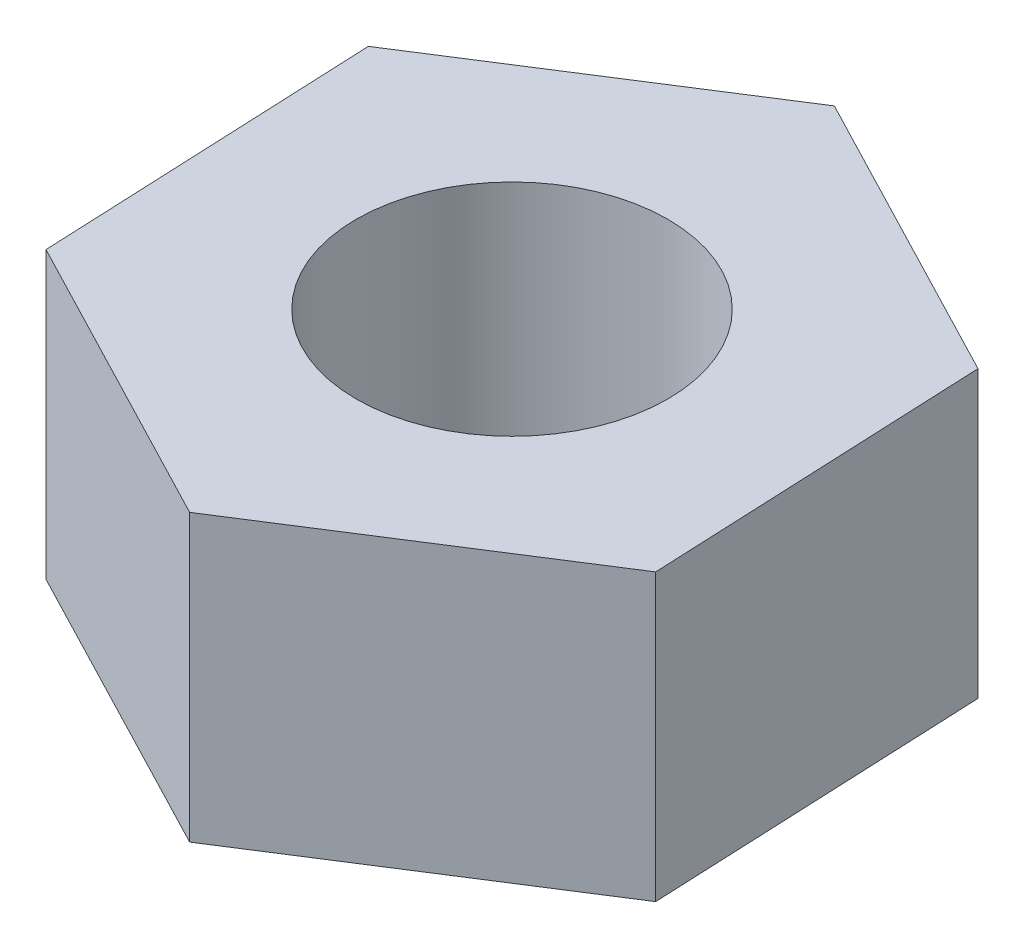
ISO-10303-21;
HEADER;
FILE_DESCRIPTION(('STEP AP214'),'2;1');
FILE_NAME('part.step','',(''),(''),'','','');
FILE_SCHEMA(('AUTOMOTIVE_DESIGN { 1 0 10303 214 1 1 1 1 }'));
ENDSEC;
DATA;
#1=APPLICATION_CONTEXT('core data for automotive mechanical design processes');
#2=APPLICATION_PROTOCOL_DEFINITION('international standard','automotive_design',2000,#1);
#3=PRODUCT_CONTEXT('',#1,'mechanical');
#4=PRODUCT('Part','Part','',(#3));
#5=PRODUCT_RELATED_PRODUCT_CATEGORY('part','',(#4));
#6=PRODUCT_DEFINITION_FORMATION('','',#4);
#7=PRODUCT_DEFINITION_CONTEXT('part definition',#1,'design');
#8=PRODUCT_DEFINITION('design','',#6,#7);
#9=PRODUCT_DEFINITION_SHAPE('','',#8);
#10=(LENGTH_UNIT() NAMED_UNIT(*) SI_UNIT(.MILLI.,.METRE.));
#11=(NAMED_UNIT(*) PLANE_ANGLE_UNIT() SI_UNIT($,.RADIAN.));
#12=(NAMED_UNIT(*) SI_UNIT($,.STERADIAN.) SOLID_ANGLE_UNIT());
#13=UNCERTAINTY_MEASURE_WITH_UNIT(LENGTH_MEASURE(1.E-05),#10,'distance_accuracy_value','');
#14=(GEOMETRIC_REPRESENTATION_CONTEXT(3) GLOBAL_UNCERTAINTY_ASSIGNED_CONTEXT((#13)) GLOBAL_UNIT_ASSIGNED_CONTEXT((#10,
#11,#12)) REPRESENTATION_CONTEXT('',''));
#15=CARTESIAN_POINT('',(0.,0.,0.));
#16=DIRECTION('',(0.,0.,1.));
#17=DIRECTION('',(1.,0.,0.));
#18=AXIS2_PLACEMENT_3D('',#15,#16,#17);
#19=CARTESIAN_POINT('',(-0.285815994218681,5.5,-6.49371305321147));
#20=DIRECTION('',(-0.461435786892992,0.,0.887173610165702));
#21=DIRECTION('',(-0.887173610165702,0.,-0.461435786892992));
#22=AXIS2_PLACEMENT_3D('',#19,#20,#21);
#23=PLANE('',#22);
#24=DIRECTION('',(0.887173610165702,0.,0.461435786892992));
#25=VECTOR('',#24,1.);
#26=CARTESIAN_POINT('',(-0.285815994218681,0.,-6.49371305321147));
#27=LINE('',#26,#25);
#28=CARTESIAN_POINT('',(-0.285815994218681,0.,-6.49371305321147));
#29=VERTEX_POINT('',#28);
#30=CARTESIAN_POINT('',(5.4808124718584,0.,-3.49438043840702));
#31=VERTEX_POINT('',#30);
#32=EDGE_CURVE('E120',#29,#31,#27,.T.);
#33=ORIENTED_EDGE('',*,*,#32,.F.);
#34=DIRECTION('',(0.,-1.,0.));
#35=VECTOR('',#34,1.);
#36=CARTESIAN_POINT('',(-0.285815994218681,5.5,-6.49371305321147));
#37=LINE('',#36,#35);
#38=CARTESIAN_POINT('',(-0.285815994218681,5.5,-6.49371305321147));
#39=VERTEX_POINT('',#38);
#40=EDGE_CURVE('E119',#39,#29,#37,.T.);
#41=ORIENTED_EDGE('',*,*,#40,.F.);
#42=DIRECTION('',(0.887173610165702,0.,0.461435786892992));
#43=VECTOR('',#42,1.);
#44=CARTESIAN_POINT('',(-0.285815994218681,5.5,-6.49371305321147));
#45=LINE('',#44,#43);
#46=CARTESIAN_POINT('',(5.4808124718584,5.5,-3.49438043840702));
#47=VERTEX_POINT('',#46);
#48=EDGE_CURVE('E133',#39,#47,#45,.T.);
#49=ORIENTED_EDGE('',*,*,#48,.T.);
#50=DIRECTION('',(0.,-1.,0.));
#51=VECTOR('',#50,1.);
#52=CARTESIAN_POINT('',(5.4808124718584,5.5,-3.49438043840702));
#53=LINE('',#52,#51);
#54=EDGE_CURVE('E11',#47,#31,#53,.T.);
#55=ORIENTED_EDGE('',*,*,#54,.T.);
#56=EDGE_LOOP('',(#33,#41,#49,#55));
#57=FACE_BOUND('',#56,.T.);
#58=ADVANCED_FACE('F37',(#57),#23,.F.);
#59=CARTESIAN_POINT('',(5.4808124718584,5.5,-3.49438043840702));
#60=DIRECTION('',(-0.999032777417146,0.,0.0439716914182564));
#61=DIRECTION('',(-0.0439716914182564,0.,-0.999032777417146));
#62=AXIS2_PLACEMENT_3D('',#59,#60,#61);
#63=PLANE('',#62);
#64=DIRECTION('',(0.0439716914182564,0.,0.999032777417146));
#65=VECTOR('',#64,1.);
#66=CARTESIAN_POINT('',(5.4808124718584,0.,-3.49438043840702));
#67=LINE('',#66,#65);
#68=CARTESIAN_POINT('',(5.76662846607707,0.,2.99933261480445));
#69=VERTEX_POINT('',#68);
#70=EDGE_CURVE('E122',#31,#69,#67,.T.);
#71=ORIENTED_EDGE('',*,*,#70,.F.);
#72=ORIENTED_EDGE('',*,*,#54,.F.);
#73=DIRECTION('',(0.0439716914182564,0.,0.999032777417146));
#74=VECTOR('',#73,1.);
#75=CARTESIAN_POINT('',(5.4808124718584,5.5,-3.49438043840702));
#76=LINE('',#75,#74);
#77=CARTESIAN_POINT('',(5.76662846607707,5.5,2.99933261480445));
#78=VERTEX_POINT('',#77);
#79=EDGE_CURVE('E85',#47,#78,#76,.T.);
#80=ORIENTED_EDGE('',*,*,#79,.T.);
#81=DIRECTION('',(0.,-1.,0.));
#82=VECTOR('',#81,1.);
#83=CARTESIAN_POINT('',(5.76662846607707,5.5,2.99933261480445));
#84=LINE('',#83,#82);
#85=EDGE_CURVE('E45',#78,#69,#84,.T.);
#86=ORIENTED_EDGE('',*,*,#85,.T.);
#87=EDGE_LOOP('',(#71,#72,#80,#86));
#88=FACE_BOUND('',#87,.T.);
#89=ADVANCED_FACE('F139',(#88),#63,.F.);
#90=CARTESIAN_POINT('',(5.76662846607707,5.5,2.99933261480445));
#91=DIRECTION('',(-0.537596990524155,0.,-0.843201918747444));
#92=DIRECTION('',(0.843201918747444,0.,-0.537596990524155));
#93=AXIS2_PLACEMENT_3D('',#90,#91,#92);
#94=PLANE('',#93);
#95=DIRECTION('',(-0.843201918747444,0.,0.537596990524155));
#96=VECTOR('',#95,1.);
#97=CARTESIAN_POINT('',(5.76662846607707,0.,2.99933261480445));
#98=LINE('',#97,#96);
#99=CARTESIAN_POINT('',(0.285815994218677,0.,6.49371305321146));
#100=VERTEX_POINT('',#99);
#101=EDGE_CURVE('E126',#69,#100,#98,.T.);
#102=ORIENTED_EDGE('',*,*,#101,.F.);
#103=ORIENTED_EDGE('',*,*,#85,.F.);
#104=DIRECTION('',(-0.843201918747444,0.,0.537596990524155));
#105=VECTOR('',#104,1.);
#106=CARTESIAN_POINT('',(5.76662846607707,5.5,2.99933261480445));
#107=LINE('',#106,#105);
#108=CARTESIAN_POINT('',(0.285815994218677,5.5,6.49371305321146));
#109=VERTEX_POINT('',#108);
#110=EDGE_CURVE('E113',#78,#109,#107,.T.);
#111=ORIENTED_EDGE('',*,*,#110,.T.);
#112=DIRECTION('',(0.,-1.,0.));
#113=VECTOR('',#112,1.);
#114=CARTESIAN_POINT('',(0.285815994218677,5.5,6.49371305321146));
#115=LINE('',#114,#113);
#116=EDGE_CURVE('E107',#109,#100,#115,.T.);
#117=ORIENTED_EDGE('',*,*,#116,.T.);
#118=EDGE_LOOP('',(#102,#103,#111,#117));
#119=FACE_BOUND('',#118,.T.);
#120=ADVANCED_FACE('F172',(#119),#94,.F.);
#121=CARTESIAN_POINT('',(0.285815994218677,5.5,6.49371305321146));
#122=DIRECTION('',(0.461435786892992,0.,-0.887173610165702));
#123=DIRECTION('',(0.887173610165702,0.,0.461435786892992));
#124=AXIS2_PLACEMENT_3D('',#121,#122,#123);
#125=PLANE('',#124);
#126=DIRECTION('',(-0.887173610165702,0.,-0.461435786892992));
#127=VECTOR('',#126,1.);
#128=CARTESIAN_POINT('',(0.285815994218677,0.,6.49371305321146));
#129=LINE('',#128,#127);
#130=CARTESIAN_POINT('',(-5.48081247185839,0.,3.49438043840701));
#131=VERTEX_POINT('',#130);
#132=EDGE_CURVE('E129',#100,#131,#129,.T.);
#133=ORIENTED_EDGE('',*,*,#132,.F.);
#134=ORIENTED_EDGE('',*,*,#116,.F.);
#135=DIRECTION('',(-0.887173610165702,0.,-0.461435786892992));
#136=VECTOR('',#135,1.);
#137=CARTESIAN_POINT('',(0.285815994218677,5.5,6.49371305321146));
#138=LINE('',#137,#136);
#139=CARTESIAN_POINT('',(-5.48081247185839,5.5,3.49438043840701));
#140=VERTEX_POINT('',#139);
#141=EDGE_CURVE('E97',#109,#140,#138,.T.);
#142=ORIENTED_EDGE('',*,*,#141,.T.);
#143=DIRECTION('',(0.,-1.,0.));
#144=VECTOR('',#143,1.);
#145=CARTESIAN_POINT('',(-5.48081247185839,5.5,3.49438043840701));
#146=LINE('',#145,#144);
#147=EDGE_CURVE('E102',#140,#131,#146,.T.);
#148=ORIENTED_EDGE('',*,*,#147,.T.);
#149=EDGE_LOOP('',(#133,#134,#142,#148));
#150=FACE_BOUND('',#149,.T.);
#151=ADVANCED_FACE('F110',(#150),#125,.F.);
#152=CARTESIAN_POINT('',(-5.48081247185839,5.5,3.49438043840701));
#153=DIRECTION('',(0.999032777417146,0.,-0.0439716914182575));
#154=DIRECTION('',(0.0439716914182575,0.,0.999032777417146));
#155=AXIS2_PLACEMENT_3D('',#152,#153,#154);
#156=PLANE('',#155);
#157=DIRECTION('',(-0.0439716914182575,0.,-0.999032777417146));
#158=VECTOR('',#157,1.);
#159=CARTESIAN_POINT('',(-5.48081247185839,0.,3.49438043840701));
#160=LINE('',#159,#158);
#161=CARTESIAN_POINT('',(-5.76662846607707,0.,-2.99933261480446));
#162=VERTEX_POINT('',#161);
#163=EDGE_CURVE('E104',#131,#162,#160,.T.);
#164=ORIENTED_EDGE('',*,*,#163,.F.);
#165=ORIENTED_EDGE('',*,*,#147,.F.);
#166=DIRECTION('',(-0.0439716914182575,0.,-0.999032777417146));
#167=VECTOR('',#166,1.);
#168=CARTESIAN_POINT('',(-5.48081247185839,5.5,3.49438043840701));
#169=LINE('',#168,#167);
#170=CARTESIAN_POINT('',(-5.76662846607707,5.5,-2.99933261480446));
#171=VERTEX_POINT('',#170);
#172=EDGE_CURVE('E93',#140,#171,#169,.T.);
#173=ORIENTED_EDGE('',*,*,#172,.T.);
#174=DIRECTION('',(0.,-1.,0.));
#175=VECTOR('',#174,1.);
#176=CARTESIAN_POINT('',(-5.76662846607707,5.5,-2.99933261480446));
#177=LINE('',#176,#175);
#178=EDGE_CURVE('E108',#171,#162,#177,.T.);
#179=ORIENTED_EDGE('',*,*,#178,.T.);
#180=EDGE_LOOP('',(#164,#165,#173,#179));
#181=FACE_BOUND('',#180,.T.);
#182=ADVANCED_FACE('F103',(#181),#156,.F.);
#183=CARTESIAN_POINT('',(-5.76662846607707,5.5,-2.99933261480446));
#184=DIRECTION('',(0.537596990524156,0.,0.843201918747444));
#185=DIRECTION('',(-0.843201918747444,0.,0.537596990524156));
#186=AXIS2_PLACEMENT_3D('',#183,#184,#185);
#187=PLANE('',#186);
#188=DIRECTION('',(0.843201918747444,0.,-0.537596990524156));
#189=VECTOR('',#188,1.);
#190=CARTESIAN_POINT('',(-5.76662846607707,0.,-2.99933261480446));
#191=LINE('',#190,#189);
#192=EDGE_CURVE('E73',#162,#29,#191,.T.);
#193=ORIENTED_EDGE('',*,*,#192,.F.);
#194=ORIENTED_EDGE('',*,*,#178,.F.);
#195=DIRECTION('',(0.843201918747444,0.,-0.537596990524156));
#196=VECTOR('',#195,1.);
#197=CARTESIAN_POINT('',(-5.76662846607707,5.5,-2.99933261480446));
#198=LINE('',#197,#196);
#199=EDGE_CURVE('E53',#171,#39,#198,.T.);
#200=ORIENTED_EDGE('',*,*,#199,.T.);
#201=ORIENTED_EDGE('',*,*,#40,.T.);
#202=EDGE_LOOP('',(#193,#194,#200,#201));
#203=FACE_BOUND('',#202,.T.);
#204=ADVANCED_FACE('F164',(#203),#187,.F.);
#205=CARTESIAN_POINT('',(0.,5.5,0.));
#206=DIRECTION('',(0.,1.,0.));
#207=DIRECTION('',(0.,0.,-1.));
#208=AXIS2_PLACEMENT_3D('',#205,#206,#207);
#209=PLANE('',#208);
#210=CARTESIAN_POINT('',(0.,5.5,0.));
#211=DIRECTION('',(0.,-1.,0.));
#212=DIRECTION('',(0.,0.,-1.));
#213=AXIS2_PLACEMENT_3D('',#210,#211,#212);
#214=CIRCLE('',#213,3.);
#215=CARTESIAN_POINT('',(0.,5.5,-3.));
#216=VERTEX_POINT('',#215);
#217=EDGE_CURVE('E148',#216,#216,#214,.T.);
#218=ORIENTED_EDGE('',*,*,#217,.T.);
#219=EDGE_LOOP('',(#218));
#220=FACE_BOUND('',#219,.T.);
#221=ORIENTED_EDGE('',*,*,#48,.F.);
#222=ORIENTED_EDGE('',*,*,#199,.F.);
#223=ORIENTED_EDGE('',*,*,#172,.F.);
#224=ORIENTED_EDGE('',*,*,#141,.F.);
#225=ORIENTED_EDGE('',*,*,#110,.F.);
#226=ORIENTED_EDGE('',*,*,#79,.F.);
#227=EDGE_LOOP('',(#221,#222,#223,#224,#225,#226));
#228=FACE_BOUND('',#227,.T.);
#229=ADVANCED_FACE('F95',(#220,#228),#209,.T.);
#230=CARTESIAN_POINT('',(0.,0.,0.));
#231=DIRECTION('',(0.,1.,0.));
#232=DIRECTION('',(0.,0.,-1.));
#233=AXIS2_PLACEMENT_3D('',#230,#231,#232);
#234=PLANE('',#233);
#235=CARTESIAN_POINT('',(0.,0.,0.));
#236=DIRECTION('',(0.,-1.,0.));
#237=DIRECTION('',(0.,0.,-1.));
#238=AXIS2_PLACEMENT_3D('',#235,#236,#237);
#239=CIRCLE('',#238,3.);
#240=CARTESIAN_POINT('',(0.,0.,-3.));
#241=VERTEX_POINT('',#240);
#242=EDGE_CURVE('E123',#241,#241,#239,.T.);
#243=ORIENTED_EDGE('',*,*,#242,.F.);
#244=EDGE_LOOP('',(#243));
#245=FACE_BOUND('',#244,.T.);
#246=ORIENTED_EDGE('',*,*,#32,.T.);
#247=ORIENTED_EDGE('',*,*,#70,.T.);
#248=ORIENTED_EDGE('',*,*,#101,.T.);
#249=ORIENTED_EDGE('',*,*,#132,.T.);
#250=ORIENTED_EDGE('',*,*,#163,.T.);
#251=ORIENTED_EDGE('',*,*,#192,.T.);
#252=EDGE_LOOP('',(#246,#247,#248,#249,#250,#251));
#253=FACE_BOUND('',#252,.T.);
#254=ADVANCED_FACE('F141',(#245,#253),#234,.F.);
#255=CARTESIAN_POINT('',(0.,0.,0.));
#256=DIRECTION('',(0.,1.,0.));
#257=DIRECTION('',(0.,0.,-1.));
#258=AXIS2_PLACEMENT_3D('',#255,#256,#257);
#259=CYLINDRICAL_SURFACE('',#258,3.);
#260=ORIENTED_EDGE('',*,*,#242,.T.);
#261=EDGE_LOOP('',(#260));
#262=FACE_BOUND('',#261,.T.);
#263=ORIENTED_EDGE('',*,*,#217,.F.);
#264=EDGE_LOOP('',(#263));
#265=FACE_BOUND('',#264,.T.);
#266=ADVANCED_FACE('F154',(#262,#265),#259,.F.);
#267=CLOSED_SHELL('',(#58,#89,#120,#151,#182,#204,#229,#254,#266));
#268=MANIFOLD_SOLID_BREP('B2',#267);
#269=ADVANCED_BREP_SHAPE_REPRESENTATION('',(#18,#268),#14);
#270=SHAPE_DEFINITION_REPRESENTATION(#9,#269);
ENDSEC;
END-ISO-10303-21;
